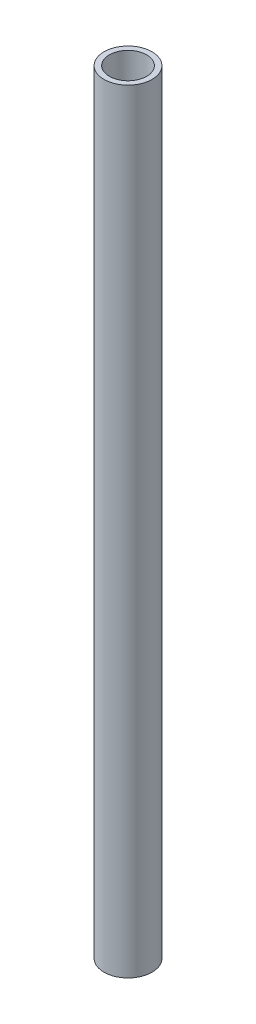
ISO-10303-21;
HEADER;
FILE_DESCRIPTION(('STEP AP214'),'2;1');
FILE_NAME('part.step','',(''),(''),'','','');
FILE_SCHEMA(('AUTOMOTIVE_DESIGN { 1 0 10303 214 1 1 1 1 }'));
ENDSEC;
DATA;
#1=APPLICATION_CONTEXT('core data for automotive mechanical design processes');
#2=APPLICATION_PROTOCOL_DEFINITION('international standard','automotive_design',2000,#1);
#3=PRODUCT_CONTEXT('',#1,'mechanical');
#4=PRODUCT('Part','Part','',(#3));
#5=PRODUCT_RELATED_PRODUCT_CATEGORY('part','',(#4));
#6=PRODUCT_DEFINITION_FORMATION('','',#4);
#7=PRODUCT_DEFINITION_CONTEXT('part definition',#1,'design');
#8=PRODUCT_DEFINITION('design','',#6,#7);
#9=PRODUCT_DEFINITION_SHAPE('','',#8);
#10=(LENGTH_UNIT() NAMED_UNIT(*) SI_UNIT(.MILLI.,.METRE.));
#11=(NAMED_UNIT(*) PLANE_ANGLE_UNIT() SI_UNIT($,.RADIAN.));
#12=(NAMED_UNIT(*) SI_UNIT($,.STERADIAN.) SOLID_ANGLE_UNIT());
#13=UNCERTAINTY_MEASURE_WITH_UNIT(LENGTH_MEASURE(1.E-05),#10,'distance_accuracy_value','');
#14=(GEOMETRIC_REPRESENTATION_CONTEXT(3) GLOBAL_UNCERTAINTY_ASSIGNED_CONTEXT((#13)) GLOBAL_UNIT_ASSIGNED_CONTEXT((#10,
#11,#12)) REPRESENTATION_CONTEXT('',''));
#15=CARTESIAN_POINT('',(0.,0.,0.));
#16=DIRECTION('',(0.,0.,1.));
#17=DIRECTION('',(1.,0.,0.));
#18=AXIS2_PLACEMENT_3D('',#15,#16,#17);
#19=CARTESIAN_POINT('',(0.,3683.,0.));
#20=DIRECTION('',(0.,1.,0.));
#21=DIRECTION('',(0.,0.,1.));
#22=AXIS2_PLACEMENT_3D('',#19,#20,#21);
#23=PLANE('',#22);
#24=CARTESIAN_POINT('',(0.,3683.,0.));
#25=DIRECTION('',(0.,1.,0.));
#26=DIRECTION('',(0.,0.,1.));
#27=AXIS2_PLACEMENT_3D('',#24,#25,#26);
#28=CIRCLE('',#27,114.3);
#29=CARTESIAN_POINT('',(0.,3683.,-114.3));
#30=VERTEX_POINT('',#29);
#31=EDGE_CURVE('E10',#30,#30,#28,.T.);
#32=ORIENTED_EDGE('',*,*,#31,.T.);
#33=EDGE_LOOP('',(#32));
#34=FACE_BOUND('',#33,.T.);
#35=CARTESIAN_POINT('',(0.,3683.,0.));
#36=DIRECTION('',(0.,1.,0.));
#37=DIRECTION('',(0.,0.,1.));
#38=AXIS2_PLACEMENT_3D('',#35,#36,#37);
#39=CIRCLE('',#38,88.9);
#40=CARTESIAN_POINT('',(0.,3683.,-88.9));
#41=VERTEX_POINT('',#40);
#42=EDGE_CURVE('E42',#41,#41,#39,.T.);
#43=ORIENTED_EDGE('',*,*,#42,.F.);
#44=EDGE_LOOP('',(#43));
#45=FACE_BOUND('',#44,.T.);
#46=ADVANCED_FACE('F31',(#34,#45),#23,.T.);
#47=CARTESIAN_POINT('',(0.,0.,0.));
#48=DIRECTION('',(0.,1.,0.));
#49=DIRECTION('',(0.,0.,1.));
#50=AXIS2_PLACEMENT_3D('',#47,#48,#49);
#51=PLANE('',#50);
#52=CARTESIAN_POINT('',(0.,0.,0.));
#53=DIRECTION('',(0.,1.,0.));
#54=DIRECTION('',(0.,0.,1.));
#55=AXIS2_PLACEMENT_3D('',#52,#53,#54);
#56=CIRCLE('',#55,114.3);
#57=CARTESIAN_POINT('',(0.,-4.44089209850063E-13,-114.3));
#58=VERTEX_POINT('',#57);
#59=EDGE_CURVE('E35',#58,#58,#56,.T.);
#60=ORIENTED_EDGE('',*,*,#59,.F.);
#61=EDGE_LOOP('',(#60));
#62=FACE_BOUND('',#61,.T.);
#63=CARTESIAN_POINT('',(0.,0.,0.));
#64=DIRECTION('',(0.,1.,0.));
#65=DIRECTION('',(0.,0.,1.));
#66=AXIS2_PLACEMENT_3D('',#63,#64,#65);
#67=CIRCLE('',#66,88.9);
#68=CARTESIAN_POINT('',(0.,-4.44089209850063E-13,-88.9));
#69=VERTEX_POINT('',#68);
#70=EDGE_CURVE('E44',#69,#69,#67,.T.);
#71=ORIENTED_EDGE('',*,*,#70,.T.);
#72=EDGE_LOOP('',(#71));
#73=FACE_BOUND('',#72,.T.);
#74=ADVANCED_FACE('F54',(#62,#73),#51,.F.);
#75=CARTESIAN_POINT('',(0.,3683.,0.));
#76=DIRECTION('',(0.,-1.,0.));
#77=DIRECTION('',(0.,0.,-1.));
#78=AXIS2_PLACEMENT_3D('',#75,#76,#77);
#79=CYLINDRICAL_SURFACE('',#78,114.3);
#80=CARTESIAN_POINT('',(0.,3683.,-114.3));
#81=CARTESIAN_POINT('',(0.,3644.63541666667,-114.3));
#82=CARTESIAN_POINT('',(0.,3606.27083333333,-114.3));
#83=CARTESIAN_POINT('',(0.,3529.54166666667,-114.3));
#84=CARTESIAN_POINT('',(0.,3491.17708333333,-114.3));
#85=CARTESIAN_POINT('',(0.,3414.44791666667,-114.3));
#86=CARTESIAN_POINT('',(0.,3376.08333333333,-114.3));
#87=CARTESIAN_POINT('',(0.,3299.35416666667,-114.3));
#88=CARTESIAN_POINT('',(0.,3260.98958333333,-114.3));
#89=CARTESIAN_POINT('',(0.,3184.26041666667,-114.3));
#90=CARTESIAN_POINT('',(0.,3145.89583333333,-114.3));
#91=CARTESIAN_POINT('',(0.,3069.16666666667,-114.3));
#92=CARTESIAN_POINT('',(0.,3030.80208333333,-114.3));
#93=CARTESIAN_POINT('',(0.,2954.07291666667,-114.3));
#94=CARTESIAN_POINT('',(0.,2915.70833333333,-114.3));
#95=CARTESIAN_POINT('',(0.,2838.97916666667,-114.3));
#96=CARTESIAN_POINT('',(0.,2800.61458333333,-114.3));
#97=CARTESIAN_POINT('',(0.,2723.88541666667,-114.3));
#98=CARTESIAN_POINT('',(0.,2685.52083333333,-114.3));
#99=CARTESIAN_POINT('',(0.,2608.79166666667,-114.3));
#100=CARTESIAN_POINT('',(0.,2570.42708333333,-114.3));
#101=CARTESIAN_POINT('',(0.,2493.69791666667,-114.3));
#102=CARTESIAN_POINT('',(0.,2455.33333333333,-114.3));
#103=CARTESIAN_POINT('',(0.,2378.60416666667,-114.3));
#104=CARTESIAN_POINT('',(0.,2340.23958333333,-114.3));
#105=CARTESIAN_POINT('',(0.,2263.51041666667,-114.3));
#106=CARTESIAN_POINT('',(0.,2225.14583333333,-114.3));
#107=CARTESIAN_POINT('',(0.,2148.41666666667,-114.3));
#108=CARTESIAN_POINT('',(0.,2110.05208333333,-114.3));
#109=CARTESIAN_POINT('',(0.,2033.32291666667,-114.3));
#110=CARTESIAN_POINT('',(0.,1994.95833333333,-114.3));
#111=CARTESIAN_POINT('',(0.,1918.22916666667,-114.3));
#112=CARTESIAN_POINT('',(0.,1879.86458333333,-114.3));
#113=CARTESIAN_POINT('',(0.,1803.13541666667,-114.3));
#114=CARTESIAN_POINT('',(0.,1764.77083333333,-114.3));
#115=CARTESIAN_POINT('',(0.,1688.04166666667,-114.3));
#116=CARTESIAN_POINT('',(0.,1649.67708333333,-114.3));
#117=CARTESIAN_POINT('',(0.,1572.94791666667,-114.3));
#118=CARTESIAN_POINT('',(0.,1534.58333333333,-114.3));
#119=CARTESIAN_POINT('',(0.,1457.85416666667,-114.3));
#120=CARTESIAN_POINT('',(0.,1419.48958333333,-114.3));
#121=CARTESIAN_POINT('',(0.,1342.76041666667,-114.3));
#122=CARTESIAN_POINT('',(0.,1304.39583333333,-114.3));
#123=CARTESIAN_POINT('',(0.,1227.66666666667,-114.3));
#124=CARTESIAN_POINT('',(0.,1189.30208333333,-114.3));
#125=CARTESIAN_POINT('',(0.,1112.57291666667,-114.3));
#126=CARTESIAN_POINT('',(0.,1074.20833333333,-114.3));
#127=CARTESIAN_POINT('',(0.,997.479166666666,-114.3));
#128=CARTESIAN_POINT('',(0.,959.114583333333,-114.3));
#129=CARTESIAN_POINT('',(0.,882.385416666666,-114.3));
#130=CARTESIAN_POINT('',(0.,844.020833333333,-114.3));
#131=CARTESIAN_POINT('',(0.,767.291666666666,-114.3));
#132=CARTESIAN_POINT('',(0.,728.927083333333,-114.3));
#133=CARTESIAN_POINT('',(0.,652.197916666666,-114.3));
#134=CARTESIAN_POINT('',(0.,613.833333333333,-114.3));
#135=CARTESIAN_POINT('',(0.,537.104166666666,-114.3));
#136=CARTESIAN_POINT('',(0.,498.739583333333,-114.3));
#137=CARTESIAN_POINT('',(0.,422.010416666666,-114.3));
#138=CARTESIAN_POINT('',(0.,383.645833333333,-114.3));
#139=CARTESIAN_POINT('',(0.,306.916666666666,-114.3));
#140=CARTESIAN_POINT('',(0.,268.552083333333,-114.3));
#141=CARTESIAN_POINT('',(0.,191.822916666666,-114.3));
#142=CARTESIAN_POINT('',(0.,153.458333333333,-114.3));
#143=CARTESIAN_POINT('',(0.,76.7291666666664,-114.3));
#144=CARTESIAN_POINT('',(0.,38.3645833333329,-114.3));
#145=CARTESIAN_POINT('',(0.,-4.44089209850063E-13,-114.3));
#146=B_SPLINE_CURVE_WITH_KNOTS('',3,(#80,#81,#82,#83,#84,#85,#86,#87,#88,#89,#90,#91,#92,#93,
#94,#95,#96,#97,#98,#99,#100,#101,#102,#103,#104,#105,#106,#107,#108,#109,#110,#111,#112,#113,
#114,#115,#116,#117,#118,#119,#120,#121,#122,#123,#124,#125,#126,#127,#128,#129,#130,#131,#132,
#133,#134,#135,#136,#137,#138,#139,#140,#141,#142,#143,#144,#145),.UNSPECIFIED.,.F.,.F.,(4,2,2,
2,2,2,2,2,2,2,2,2,2,2,2,2,2,2,2,2,2,2,2,2,2,2,2,2,2,2,2,2,4),(0.,115.09375,230.1875,345.28125,
460.375,575.46875,690.5625,805.65625,920.75,1035.84375,1150.9375,1266.03125,1381.125,1496.21875,
1611.3125,1726.40625,1841.5,1956.59375,2071.6875,2186.78125,2301.875,2416.96875,2532.0625,
2647.15625,2762.25,2877.34375,2992.4375,3107.53125,3222.625,3337.71875,3452.8125,3567.90625,
3683.),.UNSPECIFIED.);
#147=EDGE_CURVE('BSEAM33',#30,#58,#146,.T.);
#148=ORIENTED_EDGE('',*,*,#31,.F.);
#149=ORIENTED_EDGE('',*,*,#59,.T.);
#150=ORIENTED_EDGE('',*,*,#147,.T.);
#151=ORIENTED_EDGE('',*,*,#147,.F.);
#152=EDGE_LOOP('',(#148,#150,#149,#151));
#153=FACE_BOUND('',#152,.T.);
#154=ADVANCED_FACE('F33',(#153),#79,.T.);
#155=CARTESIAN_POINT('',(0.,3683.,0.));
#156=DIRECTION('',(0.,-1.,0.));
#157=DIRECTION('',(0.,0.,-1.));
#158=AXIS2_PLACEMENT_3D('',#155,#156,#157);
#159=CYLINDRICAL_SURFACE('',#158,88.9);
#160=CARTESIAN_POINT('',(0.,3683.,-88.9));
#161=CARTESIAN_POINT('',(0.,3644.63541666667,-88.9));
#162=CARTESIAN_POINT('',(0.,3606.27083333333,-88.9));
#163=CARTESIAN_POINT('',(0.,3529.54166666667,-88.9));
#164=CARTESIAN_POINT('',(0.,3491.17708333333,-88.9));
#165=CARTESIAN_POINT('',(0.,3414.44791666667,-88.9));
#166=CARTESIAN_POINT('',(0.,3376.08333333333,-88.9));
#167=CARTESIAN_POINT('',(0.,3299.35416666667,-88.9));
#168=CARTESIAN_POINT('',(0.,3260.98958333333,-88.9));
#169=CARTESIAN_POINT('',(0.,3184.26041666667,-88.9));
#170=CARTESIAN_POINT('',(0.,3145.89583333333,-88.9));
#171=CARTESIAN_POINT('',(0.,3069.16666666667,-88.9));
#172=CARTESIAN_POINT('',(0.,3030.80208333333,-88.9));
#173=CARTESIAN_POINT('',(0.,2954.07291666667,-88.9));
#174=CARTESIAN_POINT('',(0.,2915.70833333333,-88.9));
#175=CARTESIAN_POINT('',(0.,2838.97916666667,-88.9));
#176=CARTESIAN_POINT('',(0.,2800.61458333333,-88.9));
#177=CARTESIAN_POINT('',(0.,2723.88541666667,-88.9));
#178=CARTESIAN_POINT('',(0.,2685.52083333333,-88.9));
#179=CARTESIAN_POINT('',(0.,2608.79166666667,-88.9));
#180=CARTESIAN_POINT('',(0.,2570.42708333333,-88.9));
#181=CARTESIAN_POINT('',(0.,2493.69791666667,-88.9));
#182=CARTESIAN_POINT('',(0.,2455.33333333333,-88.9));
#183=CARTESIAN_POINT('',(0.,2378.60416666667,-88.9));
#184=CARTESIAN_POINT('',(0.,2340.23958333333,-88.9));
#185=CARTESIAN_POINT('',(0.,2263.51041666667,-88.9));
#186=CARTESIAN_POINT('',(0.,2225.14583333333,-88.9));
#187=CARTESIAN_POINT('',(0.,2148.41666666667,-88.9));
#188=CARTESIAN_POINT('',(0.,2110.05208333333,-88.9));
#189=CARTESIAN_POINT('',(0.,2033.32291666667,-88.9));
#190=CARTESIAN_POINT('',(0.,1994.95833333333,-88.9));
#191=CARTESIAN_POINT('',(0.,1918.22916666667,-88.9));
#192=CARTESIAN_POINT('',(0.,1879.86458333333,-88.9));
#193=CARTESIAN_POINT('',(0.,1803.13541666667,-88.9));
#194=CARTESIAN_POINT('',(0.,1764.77083333333,-88.9));
#195=CARTESIAN_POINT('',(0.,1688.04166666667,-88.9));
#196=CARTESIAN_POINT('',(0.,1649.67708333333,-88.9));
#197=CARTESIAN_POINT('',(0.,1572.94791666667,-88.9));
#198=CARTESIAN_POINT('',(0.,1534.58333333333,-88.9));
#199=CARTESIAN_POINT('',(0.,1457.85416666667,-88.9));
#200=CARTESIAN_POINT('',(0.,1419.48958333333,-88.9));
#201=CARTESIAN_POINT('',(0.,1342.76041666667,-88.9));
#202=CARTESIAN_POINT('',(0.,1304.39583333333,-88.9));
#203=CARTESIAN_POINT('',(0.,1227.66666666667,-88.9));
#204=CARTESIAN_POINT('',(0.,1189.30208333333,-88.9));
#205=CARTESIAN_POINT('',(0.,1112.57291666667,-88.9));
#206=CARTESIAN_POINT('',(0.,1074.20833333333,-88.9));
#207=CARTESIAN_POINT('',(0.,997.479166666666,-88.9));
#208=CARTESIAN_POINT('',(0.,959.114583333333,-88.9));
#209=CARTESIAN_POINT('',(0.,882.385416666666,-88.9));
#210=CARTESIAN_POINT('',(0.,844.020833333333,-88.9));
#211=CARTESIAN_POINT('',(0.,767.291666666666,-88.9));
#212=CARTESIAN_POINT('',(0.,728.927083333333,-88.9));
#213=CARTESIAN_POINT('',(0.,652.197916666666,-88.9));
#214=CARTESIAN_POINT('',(0.,613.833333333333,-88.9));
#215=CARTESIAN_POINT('',(0.,537.104166666666,-88.9));
#216=CARTESIAN_POINT('',(0.,498.739583333333,-88.9));
#217=CARTESIAN_POINT('',(0.,422.010416666666,-88.9));
#218=CARTESIAN_POINT('',(0.,383.645833333333,-88.9));
#219=CARTESIAN_POINT('',(0.,306.916666666666,-88.9));
#220=CARTESIAN_POINT('',(0.,268.552083333333,-88.9));
#221=CARTESIAN_POINT('',(0.,191.822916666666,-88.9));
#222=CARTESIAN_POINT('',(0.,153.458333333333,-88.9));
#223=CARTESIAN_POINT('',(0.,76.7291666666664,-88.9));
#224=CARTESIAN_POINT('',(0.,38.3645833333329,-88.9));
#225=CARTESIAN_POINT('',(0.,-4.44089209850063E-13,-88.9));
#226=B_SPLINE_CURVE_WITH_KNOTS('',3,(#160,#161,#162,#163,#164,#165,#166,#167,#168,#169,#170,
#171,#172,#173,#174,#175,#176,#177,#178,#179,#180,#181,#182,#183,#184,#185,#186,#187,#188,#189,
#190,#191,#192,#193,#194,#195,#196,#197,#198,#199,#200,#201,#202,#203,#204,#205,#206,#207,#208,
#209,#210,#211,#212,#213,#214,#215,#216,#217,#218,#219,#220,#221,#222,#223,#224,#225),
.UNSPECIFIED.,.F.,.F.,(4,2,2,2,2,2,2,2,2,2,2,2,2,2,2,2,2,2,2,2,2,2,2,2,2,2,2,2,2,2,2,2,4),(0.,
115.09375,230.1875,345.28125,460.375,575.46875,690.5625,805.65625,920.75,1035.84375,1150.9375,
1266.03125,1381.125,1496.21875,1611.3125,1726.40625,1841.5,1956.59375,2071.6875,2186.78125,
2301.875,2416.96875,2532.0625,2647.15625,2762.25,2877.34375,2992.4375,3107.53125,3222.625,
3337.71875,3452.8125,3567.90625,3683.),.UNSPECIFIED.);
#227=EDGE_CURVE('BSEAM50',#41,#69,#226,.T.);
#228=ORIENTED_EDGE('',*,*,#42,.T.);
#229=ORIENTED_EDGE('',*,*,#70,.F.);
#230=ORIENTED_EDGE('',*,*,#227,.T.);
#231=ORIENTED_EDGE('',*,*,#227,.F.);
#232=EDGE_LOOP('',(#228,#230,#229,#231));
#233=FACE_BOUND('',#232,.T.);
#234=ADVANCED_FACE('F50',(#233),#159,.F.);
#235=CLOSED_SHELL('',(#46,#74,#154,#234));
#236=MANIFOLD_SOLID_BREP('B2',#235);
#237=ADVANCED_BREP_SHAPE_REPRESENTATION('',(#18,#236),#14);
#238=SHAPE_DEFINITION_REPRESENTATION(#9,#237);
ENDSEC;
END-ISO-10303-21;
